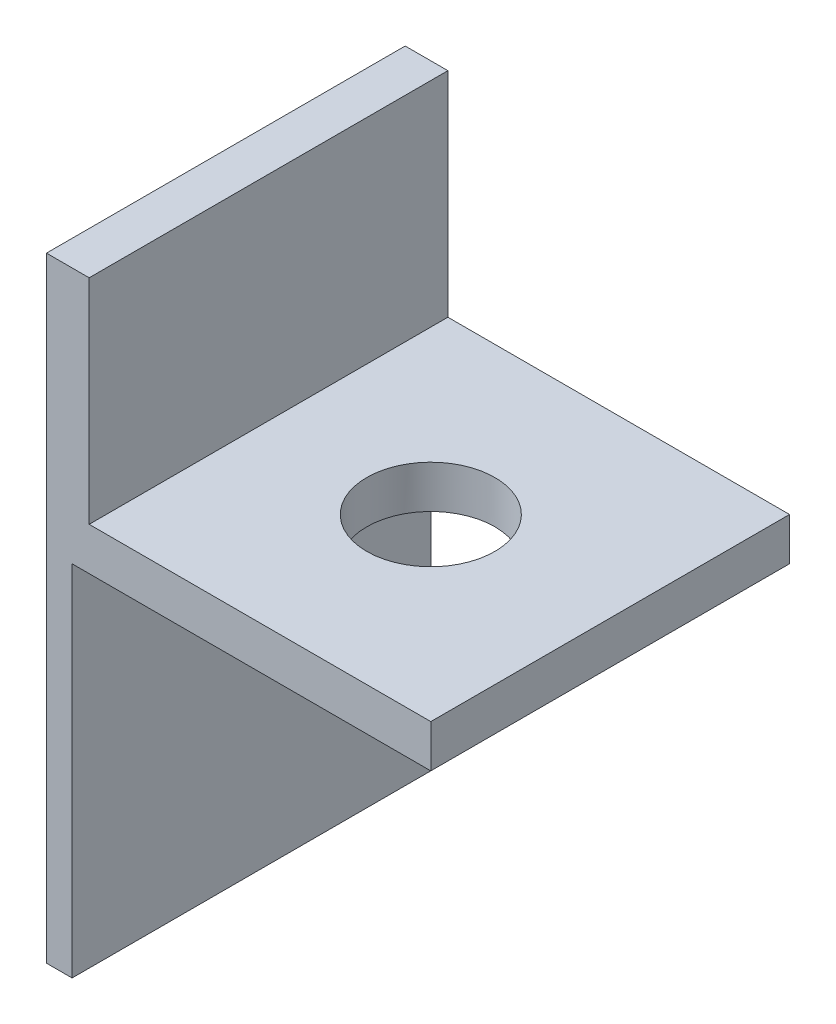
ISO-10303-21;
HEADER;
FILE_DESCRIPTION(('STEP AP214'),'2;1');
FILE_NAME('part.step','',(''),(''),'','','');
FILE_SCHEMA(('AUTOMOTIVE_DESIGN { 1 0 10303 214 1 1 1 1 }'));
ENDSEC;
DATA;
#1=APPLICATION_CONTEXT('core data for automotive mechanical design processes');
#2=APPLICATION_PROTOCOL_DEFINITION('international standard','automotive_design',2000,#1);
#3=PRODUCT_CONTEXT('',#1,'mechanical');
#4=PRODUCT('Part','Part','',(#3));
#5=PRODUCT_RELATED_PRODUCT_CATEGORY('part','',(#4));
#6=PRODUCT_DEFINITION_FORMATION('','',#4);
#7=PRODUCT_DEFINITION_CONTEXT('part definition',#1,'design');
#8=PRODUCT_DEFINITION('design','',#6,#7);
#9=PRODUCT_DEFINITION_SHAPE('','',#8);
#10=(LENGTH_UNIT() NAMED_UNIT(*) SI_UNIT(.MILLI.,.METRE.));
#11=(NAMED_UNIT(*) PLANE_ANGLE_UNIT() SI_UNIT($,.RADIAN.));
#12=(NAMED_UNIT(*) SI_UNIT($,.STERADIAN.) SOLID_ANGLE_UNIT());
#13=UNCERTAINTY_MEASURE_WITH_UNIT(LENGTH_MEASURE(1.E-05),#10,'distance_accuracy_value','');
#14=(GEOMETRIC_REPRESENTATION_CONTEXT(3) GLOBAL_UNCERTAINTY_ASSIGNED_CONTEXT((#13)) GLOBAL_UNIT_ASSIGNED_CONTEXT((#10,
#11,#12)) REPRESENTATION_CONTEXT('',''));
#15=CARTESIAN_POINT('',(0.,0.,0.));
#16=DIRECTION('',(0.,0.,1.));
#17=DIRECTION('',(1.,0.,0.));
#18=AXIS2_PLACEMENT_3D('',#15,#16,#17);
#19=CARTESIAN_POINT('',(0.,0.,0.));
#20=DIRECTION('',(0.,-1.,0.));
#21=DIRECTION('',(0.,0.,-1.));
#22=AXIS2_PLACEMENT_3D('',#19,#20,#21);
#23=PLANE('',#22);
#24=CARTESIAN_POINT('',(0.,0.,0.));
#25=DIRECTION('',(0.,-1.,0.));
#26=DIRECTION('',(0.,0.,-1.));
#27=AXIS2_PLACEMENT_3D('',#24,#25,#26);
#28=CIRCLE('',#27,7.5);
#29=CARTESIAN_POINT('',(0.,0.,-7.5));
#30=VERTEX_POINT('',#29);
#31=EDGE_CURVE('E141',#30,#30,#28,.T.);
#32=ORIENTED_EDGE('',*,*,#31,.F.);
#33=EDGE_LOOP('',(#32));
#34=FACE_BOUND('',#33,.T.);
#35=DIRECTION('',(1.,0.,0.));
#36=VECTOR('',#35,1.);
#37=CARTESIAN_POINT('',(-21.,0.,21.));
#38=LINE('',#37,#36);
#39=CARTESIAN_POINT('',(-21.,0.,21.));
#40=VERTEX_POINT('',#39);
#41=CARTESIAN_POINT('',(21.,0.,21.));
#42=VERTEX_POINT('',#41);
#43=EDGE_CURVE('E184',#40,#42,#38,.T.);
#44=ORIENTED_EDGE('',*,*,#43,.F.);
#45=DIRECTION('',(0.,0.,-1.));
#46=VECTOR('',#45,1.);
#47=CARTESIAN_POINT('',(-21.,0.,0.));
#48=LINE('',#47,#46);
#49=CARTESIAN_POINT('',(-21.,0.,-21.));
#50=VERTEX_POINT('',#49);
#51=EDGE_CURVE('E118',#40,#50,#48,.T.);
#52=ORIENTED_EDGE('',*,*,#51,.T.);
#53=DIRECTION('',(-1.,0.,0.));
#54=VECTOR('',#53,1.);
#55=CARTESIAN_POINT('',(-21.,0.,-21.));
#56=LINE('',#55,#54);
#57=CARTESIAN_POINT('',(21.,0.,-21.));
#58=VERTEX_POINT('',#57);
#59=EDGE_CURVE('E194',#58,#50,#56,.T.);
#60=ORIENTED_EDGE('',*,*,#59,.F.);
#61=DIRECTION('',(0.,0.,-1.));
#62=VECTOR('',#61,1.);
#63=CARTESIAN_POINT('',(21.,0.,21.));
#64=LINE('',#63,#62);
#65=EDGE_CURVE('E178',#42,#58,#64,.T.);
#66=ORIENTED_EDGE('',*,*,#65,.F.);
#67=EDGE_LOOP('',(#44,#52,#60,#66));
#68=FACE_BOUND('',#67,.T.);
#69=ADVANCED_FACE('F46',(#34,#68),#23,.T.);
#70=CARTESIAN_POINT('',(21.,5.,21.));
#71=DIRECTION('',(-1.,0.,0.));
#72=DIRECTION('',(0.,0.,1.));
#73=AXIS2_PLACEMENT_3D('',#70,#71,#72);
#74=PLANE('',#73);
#75=ORIENTED_EDGE('',*,*,#65,.T.);
#76=DIRECTION('',(0.,-1.,0.));
#77=VECTOR('',#76,1.);
#78=CARTESIAN_POINT('',(21.,5.,-21.));
#79=LINE('',#78,#77);
#80=CARTESIAN_POINT('',(21.,5.,-21.));
#81=VERTEX_POINT('',#80);
#82=EDGE_CURVE('E11',#81,#58,#79,.T.);
#83=ORIENTED_EDGE('',*,*,#82,.F.);
#84=DIRECTION('',(0.,0.,-1.));
#85=VECTOR('',#84,1.);
#86=CARTESIAN_POINT('',(21.,5.,21.));
#87=LINE('',#86,#85);
#88=CARTESIAN_POINT('',(21.,5.,21.));
#89=VERTEX_POINT('',#88);
#90=EDGE_CURVE('E179',#89,#81,#87,.T.);
#91=ORIENTED_EDGE('',*,*,#90,.F.);
#92=DIRECTION('',(0.,-1.,0.));
#93=VECTOR('',#92,1.);
#94=CARTESIAN_POINT('',(21.,5.,21.));
#95=LINE('',#94,#93);
#96=EDGE_CURVE('E55',#89,#42,#95,.T.);
#97=ORIENTED_EDGE('',*,*,#96,.T.);
#98=EDGE_LOOP('',(#75,#83,#91,#97));
#99=FACE_BOUND('',#98,.T.);
#100=ADVANCED_FACE('F48',(#99),#74,.F.);
#101=CARTESIAN_POINT('',(-21.,5.,-21.));
#102=DIRECTION('',(0.,0.,1.));
#103=DIRECTION('',(1.,0.,0.));
#104=AXIS2_PLACEMENT_3D('',#101,#102,#103);
#105=PLANE('',#104);
#106=ORIENTED_EDGE('',*,*,#59,.T.);
#107=DIRECTION('',(0.,1.,0.));
#108=VECTOR('',#107,1.);
#109=CARTESIAN_POINT('',(-21.,-42.,-21.));
#110=LINE('',#109,#108);
#111=CARTESIAN_POINT('',(-21.,-42.,-21.));
#112=VERTEX_POINT('',#111);
#113=EDGE_CURVE('E62',#112,#50,#110,.T.);
#114=ORIENTED_EDGE('',*,*,#113,.F.);
#115=DIRECTION('',(1.,0.,0.));
#116=VECTOR('',#115,1.);
#117=CARTESIAN_POINT('',(0.,-42.,-21.));
#118=LINE('',#117,#116);
#119=CARTESIAN_POINT('',(-24.,-42.,-21.));
#120=VERTEX_POINT('',#119);
#121=EDGE_CURVE('E137',#120,#112,#118,.T.);
#122=ORIENTED_EDGE('',*,*,#121,.F.);
#123=DIRECTION('',(0.,-1.,0.));
#124=VECTOR('',#123,1.);
#125=CARTESIAN_POINT('',(-24.,5.,-21.));
#126=LINE('',#125,#124);
#127=CARTESIAN_POINT('',(-24.,30.,-21.));
#128=VERTEX_POINT('',#127);
#129=EDGE_CURVE('E173',#128,#120,#126,.T.);
#130=ORIENTED_EDGE('',*,*,#129,.F.);
#131=DIRECTION('',(-1.,0.,0.));
#132=VECTOR('',#131,1.);
#133=CARTESIAN_POINT('',(0.,30.,-21.));
#134=LINE('',#133,#132);
#135=CARTESIAN_POINT('',(-19.,30.,-21.));
#136=VERTEX_POINT('',#135);
#137=EDGE_CURVE('E155',#136,#128,#134,.T.);
#138=ORIENTED_EDGE('',*,*,#137,.F.);
#139=DIRECTION('',(0.,-1.,0.));
#140=VECTOR('',#139,1.);
#141=CARTESIAN_POINT('',(-19.,30.,-21.));
#142=LINE('',#141,#140);
#143=CARTESIAN_POINT('',(-19.,5.,-21.));
#144=VERTEX_POINT('',#143);
#145=EDGE_CURVE('E170',#136,#144,#142,.T.);
#146=ORIENTED_EDGE('',*,*,#145,.T.);
#147=DIRECTION('',(-1.,0.,0.));
#148=VECTOR('',#147,1.);
#149=CARTESIAN_POINT('',(-21.,5.,-21.));
#150=LINE('',#149,#148);
#151=EDGE_CURVE('E183',#81,#144,#150,.T.);
#152=ORIENTED_EDGE('',*,*,#151,.F.);
#153=ORIENTED_EDGE('',*,*,#82,.T.);
#154=EDGE_LOOP('',(#106,#114,#122,#130,#138,#146,#152,#153));
#155=FACE_BOUND('',#154,.T.);
#156=ADVANCED_FACE('F209',(#155),#105,.F.);
#157=CARTESIAN_POINT('',(-21.,5.,21.));
#158=DIRECTION('',(0.,0.,-1.));
#159=DIRECTION('',(-1.,0.,0.));
#160=AXIS2_PLACEMENT_3D('',#157,#158,#159);
#161=PLANE('',#160);
#162=DIRECTION('',(0.,1.,0.));
#163=VECTOR('',#162,1.);
#164=CARTESIAN_POINT('',(-24.,0.,21.));
#165=LINE('',#164,#163);
#166=CARTESIAN_POINT('',(-24.,-42.,21.));
#167=VERTEX_POINT('',#166);
#168=CARTESIAN_POINT('',(-24.,30.,21.));
#169=VERTEX_POINT('',#168);
#170=EDGE_CURVE('E128',#167,#169,#165,.T.);
#171=ORIENTED_EDGE('',*,*,#170,.F.);
#172=DIRECTION('',(-1.,0.,0.));
#173=VECTOR('',#172,1.);
#174=CARTESIAN_POINT('',(0.,-42.,21.));
#175=LINE('',#174,#173);
#176=CARTESIAN_POINT('',(-21.,-42.,21.));
#177=VERTEX_POINT('',#176);
#178=EDGE_CURVE('E125',#177,#167,#175,.T.);
#179=ORIENTED_EDGE('',*,*,#178,.F.);
#180=DIRECTION('',(0.,1.,0.));
#181=VECTOR('',#180,1.);
#182=CARTESIAN_POINT('',(-21.,-42.,21.));
#183=LINE('',#182,#181);
#184=EDGE_CURVE('E113',#177,#40,#183,.T.);
#185=ORIENTED_EDGE('',*,*,#184,.T.);
#186=ORIENTED_EDGE('',*,*,#43,.T.);
#187=ORIENTED_EDGE('',*,*,#96,.F.);
#188=DIRECTION('',(1.,0.,0.));
#189=VECTOR('',#188,1.);
#190=CARTESIAN_POINT('',(-21.,5.,21.));
#191=LINE('',#190,#189);
#192=CARTESIAN_POINT('',(-19.,5.,21.));
#193=VERTEX_POINT('',#192);
#194=EDGE_CURVE('E188',#193,#89,#191,.T.);
#195=ORIENTED_EDGE('',*,*,#194,.F.);
#196=DIRECTION('',(0.,-1.,0.));
#197=VECTOR('',#196,1.);
#198=CARTESIAN_POINT('',(-19.,30.,21.));
#199=LINE('',#198,#197);
#200=CARTESIAN_POINT('',(-19.,30.,21.));
#201=VERTEX_POINT('',#200);
#202=EDGE_CURVE('E70',#201,#193,#199,.T.);
#203=ORIENTED_EDGE('',*,*,#202,.F.);
#204=DIRECTION('',(1.,0.,0.));
#205=VECTOR('',#204,1.);
#206=CARTESIAN_POINT('',(0.,30.,21.));
#207=LINE('',#206,#205);
#208=EDGE_CURVE('E163',#169,#201,#207,.T.);
#209=ORIENTED_EDGE('',*,*,#208,.F.);
#210=EDGE_LOOP('',(#171,#179,#185,#186,#187,#195,#203,#209));
#211=FACE_BOUND('',#210,.T.);
#212=ADVANCED_FACE('F126',(#211),#161,.F.);
#213=CARTESIAN_POINT('',(0.,5.,0.));
#214=DIRECTION('',(0.,-1.,0.));
#215=DIRECTION('',(0.,0.,-1.));
#216=AXIS2_PLACEMENT_3D('',#213,#214,#215);
#217=PLANE('',#216);
#218=CARTESIAN_POINT('',(0.,5.,0.));
#219=DIRECTION('',(0.,1.,0.));
#220=DIRECTION('',(0.,0.,1.));
#221=AXIS2_PLACEMENT_3D('',#218,#219,#220);
#222=CIRCLE('',#221,7.5);
#223=CARTESIAN_POINT('',(0.,5.,7.5));
#224=VERTEX_POINT('',#223);
#225=EDGE_CURVE('E363',#224,#224,#222,.T.);
#226=ORIENTED_EDGE('',*,*,#225,.F.);
#227=EDGE_LOOP('',(#226));
#228=FACE_BOUND('',#227,.T.);
#229=ORIENTED_EDGE('',*,*,#151,.T.);
#230=DIRECTION('',(0.,0.,1.));
#231=VECTOR('',#230,1.);
#232=CARTESIAN_POINT('',(-19.,5.,0.));
#233=LINE('',#232,#231);
#234=EDGE_CURVE('E122',#144,#193,#233,.T.);
#235=ORIENTED_EDGE('',*,*,#234,.T.);
#236=ORIENTED_EDGE('',*,*,#194,.T.);
#237=ORIENTED_EDGE('',*,*,#90,.T.);
#238=EDGE_LOOP('',(#229,#235,#236,#237));
#239=FACE_BOUND('',#238,.T.);
#240=ADVANCED_FACE('F212',(#228,#239),#217,.F.);
#241=CARTESIAN_POINT('',(-24.,0.,0.));
#242=DIRECTION('',(-1.,0.,0.));
#243=DIRECTION('',(0.,0.,1.));
#244=AXIS2_PLACEMENT_3D('',#241,#242,#243);
#245=PLANE('',#244);
#246=ORIENTED_EDGE('',*,*,#129,.T.);
#247=DIRECTION('',(0.,0.,-1.));
#248=VECTOR('',#247,1.);
#249=CARTESIAN_POINT('',(-24.,-42.,0.));
#250=LINE('',#249,#248);
#251=EDGE_CURVE('E133',#167,#120,#250,.T.);
#252=ORIENTED_EDGE('',*,*,#251,.F.);
#253=ORIENTED_EDGE('',*,*,#170,.T.);
#254=DIRECTION('',(0.,0.,1.));
#255=VECTOR('',#254,1.);
#256=CARTESIAN_POINT('',(-24.,30.,0.));
#257=LINE('',#256,#255);
#258=EDGE_CURVE('E159',#128,#169,#257,.T.);
#259=ORIENTED_EDGE('',*,*,#258,.F.);
#260=EDGE_LOOP('',(#246,#252,#253,#259));
#261=FACE_BOUND('',#260,.T.);
#262=ADVANCED_FACE('F219',(#261),#245,.T.);
#263=CARTESIAN_POINT('',(-19.,30.,0.));
#264=DIRECTION('',(1.,0.,0.));
#265=DIRECTION('',(0.,0.,-1.));
#266=AXIS2_PLACEMENT_3D('',#263,#264,#265);
#267=PLANE('',#266);
#268=ORIENTED_EDGE('',*,*,#234,.F.);
#269=ORIENTED_EDGE('',*,*,#145,.F.);
#270=DIRECTION('',(0.,0.,1.));
#271=VECTOR('',#270,1.);
#272=CARTESIAN_POINT('',(-19.,30.,0.));
#273=LINE('',#272,#271);
#274=EDGE_CURVE('E152',#136,#201,#273,.T.);
#275=ORIENTED_EDGE('',*,*,#274,.T.);
#276=ORIENTED_EDGE('',*,*,#202,.T.);
#277=EDGE_LOOP('',(#268,#269,#275,#276));
#278=FACE_BOUND('',#277,.T.);
#279=ADVANCED_FACE('F214',(#278),#267,.T.);
#280=CARTESIAN_POINT('',(0.,30.,0.));
#281=DIRECTION('',(0.,1.,0.));
#282=DIRECTION('',(0.,0.,1.));
#283=AXIS2_PLACEMENT_3D('',#280,#281,#282);
#284=PLANE('',#283);
#285=ORIENTED_EDGE('',*,*,#274,.F.);
#286=ORIENTED_EDGE('',*,*,#137,.T.);
#287=ORIENTED_EDGE('',*,*,#258,.T.);
#288=ORIENTED_EDGE('',*,*,#208,.T.);
#289=EDGE_LOOP('',(#285,#286,#287,#288));
#290=FACE_BOUND('',#289,.T.);
#291=ADVANCED_FACE('F216',(#290),#284,.T.);
#292=CARTESIAN_POINT('',(-21.,-42.,0.));
#293=DIRECTION('',(1.,0.,0.));
#294=DIRECTION('',(0.,0.,-1.));
#295=AXIS2_PLACEMENT_3D('',#292,#293,#294);
#296=PLANE('',#295);
#297=ORIENTED_EDGE('',*,*,#51,.F.);
#298=ORIENTED_EDGE('',*,*,#184,.F.);
#299=DIRECTION('',(0.,0.,-1.));
#300=VECTOR('',#299,1.);
#301=CARTESIAN_POINT('',(-21.,-42.,0.));
#302=LINE('',#301,#300);
#303=EDGE_CURVE('E117',#177,#112,#302,.T.);
#304=ORIENTED_EDGE('',*,*,#303,.T.);
#305=ORIENTED_EDGE('',*,*,#113,.T.);
#306=EDGE_LOOP('',(#297,#298,#304,#305));
#307=FACE_BOUND('',#306,.T.);
#308=ADVANCED_FACE('F115',(#307),#296,.T.);
#309=CARTESIAN_POINT('',(0.,-42.,0.));
#310=DIRECTION('',(0.,-1.,0.));
#311=DIRECTION('',(0.,0.,-1.));
#312=AXIS2_PLACEMENT_3D('',#309,#310,#311);
#313=PLANE('',#312);
#314=ORIENTED_EDGE('',*,*,#303,.F.);
#315=ORIENTED_EDGE('',*,*,#178,.T.);
#316=ORIENTED_EDGE('',*,*,#251,.T.);
#317=ORIENTED_EDGE('',*,*,#121,.T.);
#318=EDGE_LOOP('',(#314,#315,#316,#317));
#319=FACE_BOUND('',#318,.T.);
#320=ADVANCED_FACE('F135',(#319),#313,.T.);
#321=CARTESIAN_POINT('',(0.,-20.,0.));
#322=DIRECTION('',(0.,1.,0.));
#323=DIRECTION('',(0.,0.,1.));
#324=AXIS2_PLACEMENT_3D('',#321,#322,#323);
#325=CYLINDRICAL_SURFACE('',#324,7.5);
#326=ORIENTED_EDGE('',*,*,#31,.T.);
#327=EDGE_LOOP('',(#326));
#328=FACE_BOUND('',#327,.T.);
#329=ORIENTED_EDGE('',*,*,#225,.T.);
#330=EDGE_LOOP('',(#329));
#331=FACE_BOUND('',#330,.T.);
#332=ADVANCED_FACE('F279',(#328,#331),#325,.F.);
#333=CLOSED_SHELL('',(#69,#100,#156,#212,#240,#262,#279,#291,#308,#320,#332));
#334=MANIFOLD_SOLID_BREP('B2',#333);
#335=ADVANCED_BREP_SHAPE_REPRESENTATION('',(#18,#334),#14);
#336=SHAPE_DEFINITION_REPRESENTATION(#9,#335);
ENDSEC;
END-ISO-10303-21;
